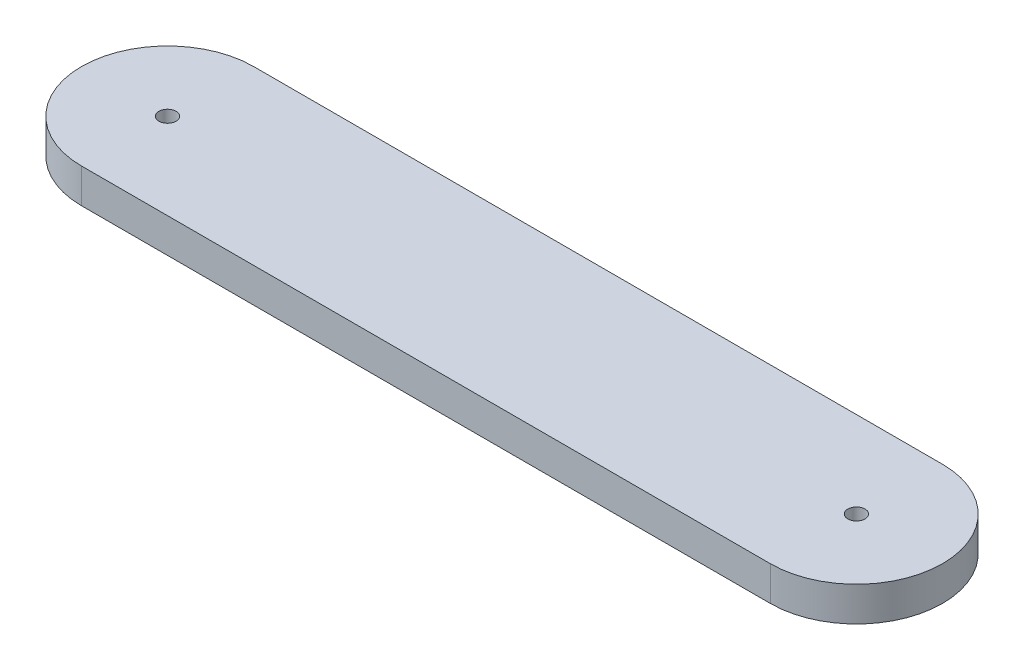
ISO-10303-21;
HEADER;
FILE_DESCRIPTION(('STEP AP214'),'2;1');
FILE_NAME('part.step','',(''),(''),'','','');
FILE_SCHEMA(('AUTOMOTIVE_DESIGN { 1 0 10303 214 1 1 1 1 }'));
ENDSEC;
DATA;
#1=APPLICATION_CONTEXT('core data for automotive mechanical design processes');
#2=APPLICATION_PROTOCOL_DEFINITION('international standard','automotive_design',2000,#1);
#3=PRODUCT_CONTEXT('',#1,'mechanical');
#4=PRODUCT('Part','Part','',(#3));
#5=PRODUCT_RELATED_PRODUCT_CATEGORY('part','',(#4));
#6=PRODUCT_DEFINITION_FORMATION('','',#4);
#7=PRODUCT_DEFINITION_CONTEXT('part definition',#1,'design');
#8=PRODUCT_DEFINITION('design','',#6,#7);
#9=PRODUCT_DEFINITION_SHAPE('','',#8);
#10=(LENGTH_UNIT() NAMED_UNIT(*) SI_UNIT(.MILLI.,.METRE.));
#11=(NAMED_UNIT(*) PLANE_ANGLE_UNIT() SI_UNIT($,.RADIAN.));
#12=(NAMED_UNIT(*) SI_UNIT($,.STERADIAN.) SOLID_ANGLE_UNIT());
#13=UNCERTAINTY_MEASURE_WITH_UNIT(LENGTH_MEASURE(1.E-05),#10,'distance_accuracy_value','');
#14=(GEOMETRIC_REPRESENTATION_CONTEXT(3) GLOBAL_UNCERTAINTY_ASSIGNED_CONTEXT((#13)) GLOBAL_UNIT_ASSIGNED_CONTEXT((#10,
#11,#12)) REPRESENTATION_CONTEXT('',''));
#15=CARTESIAN_POINT('',(0.,0.,0.));
#16=DIRECTION('',(0.,0.,1.));
#17=DIRECTION('',(1.,0.,0.));
#18=AXIS2_PLACEMENT_3D('',#15,#16,#17);
#19=CARTESIAN_POINT('',(0.,10.,0.));
#20=DIRECTION('',(0.,1.,0.));
#21=DIRECTION('',(0.,0.,1.));
#22=AXIS2_PLACEMENT_3D('',#19,#20,#21);
#23=PLANE('',#22);
#24=CARTESIAN_POINT('',(200.,10.,0.));
#25=DIRECTION('',(0.,1.,0.));
#26=DIRECTION('',(0.,0.,1.));
#27=AXIS2_PLACEMENT_3D('',#24,#25,#26);
#28=CIRCLE('',#27,2.5);
#29=CARTESIAN_POINT('',(200.,10.,2.5));
#30=VERTEX_POINT('',#29);
#31=EDGE_CURVE('E100',#30,#30,#28,.T.);
#32=ORIENTED_EDGE('',*,*,#31,.F.);
#33=EDGE_LOOP('',(#32));
#34=FACE_BOUND('',#33,.T.);
#35=CARTESIAN_POINT('',(0.,10.,0.));
#36=DIRECTION('',(0.,1.,0.));
#37=DIRECTION('',(0.,0.,1.));
#38=AXIS2_PLACEMENT_3D('',#35,#36,#37);
#39=CIRCLE('',#38,25.);
#40=CARTESIAN_POINT('',(0.,10.,-25.));
#41=VERTEX_POINT('',#40);
#42=CARTESIAN_POINT('',(0.,10.,25.));
#43=VERTEX_POINT('',#42);
#44=EDGE_CURVE('E85',#41,#43,#39,.T.);
#45=ORIENTED_EDGE('',*,*,#44,.T.);
#46=DIRECTION('',(1.,0.,0.));
#47=VECTOR('',#46,1.);
#48=CARTESIAN_POINT('',(0.,10.,25.));
#49=LINE('',#48,#47);
#50=CARTESIAN_POINT('',(200.,10.,25.));
#51=VERTEX_POINT('',#50);
#52=EDGE_CURVE('E80',#43,#51,#49,.T.);
#53=ORIENTED_EDGE('',*,*,#52,.T.);
#54=CARTESIAN_POINT('',(200.,10.,0.));
#55=DIRECTION('',(0.,1.,0.));
#56=DIRECTION('',(0.,0.,1.));
#57=AXIS2_PLACEMENT_3D('',#54,#55,#56);
#58=CIRCLE('',#57,25.);
#59=CARTESIAN_POINT('',(200.,10.,-25.));
#60=VERTEX_POINT('',#59);
#61=EDGE_CURVE('E83',#51,#60,#58,.T.);
#62=ORIENTED_EDGE('',*,*,#61,.T.);
#63=DIRECTION('',(-1.,0.,0.));
#64=VECTOR('',#63,1.);
#65=CARTESIAN_POINT('',(0.,10.,-25.));
#66=LINE('',#65,#64);
#67=EDGE_CURVE('E50',#60,#41,#66,.T.);
#68=ORIENTED_EDGE('',*,*,#67,.T.);
#69=EDGE_LOOP('',(#45,#53,#62,#68));
#70=FACE_BOUND('',#69,.T.);
#71=CARTESIAN_POINT('',(0.,10.,0.));
#72=DIRECTION('',(0.,1.,0.));
#73=DIRECTION('',(0.,0.,1.));
#74=AXIS2_PLACEMENT_3D('',#71,#72,#73);
#75=CIRCLE('',#74,2.5);
#76=CARTESIAN_POINT('',(0.,10.,2.5));
#77=VERTEX_POINT('',#76);
#78=EDGE_CURVE('E115',#77,#77,#75,.T.);
#79=ORIENTED_EDGE('',*,*,#78,.F.);
#80=EDGE_LOOP('',(#79));
#81=FACE_BOUND('',#80,.T.);
#82=ADVANCED_FACE('F33',(#34,#70,#81),#23,.T.);
#83=CARTESIAN_POINT('',(0.,0.,0.));
#84=DIRECTION('',(0.,1.,0.));
#85=DIRECTION('',(0.,0.,1.));
#86=AXIS2_PLACEMENT_3D('',#83,#84,#85);
#87=PLANE('',#86);
#88=CARTESIAN_POINT('',(0.,0.,0.));
#89=DIRECTION('',(0.,1.,0.));
#90=DIRECTION('',(0.,0.,1.));
#91=AXIS2_PLACEMENT_3D('',#88,#89,#90);
#92=CIRCLE('',#91,25.);
#93=CARTESIAN_POINT('',(0.,0.,-25.));
#94=VERTEX_POINT('',#93);
#95=CARTESIAN_POINT('',(0.,0.,25.));
#96=VERTEX_POINT('',#95);
#97=EDGE_CURVE('E97',#94,#96,#92,.T.);
#98=ORIENTED_EDGE('',*,*,#97,.F.);
#99=DIRECTION('',(-1.,0.,0.));
#100=VECTOR('',#99,1.);
#101=CARTESIAN_POINT('',(0.,0.,-25.));
#102=LINE('',#101,#100);
#103=CARTESIAN_POINT('',(200.,0.,-25.));
#104=VERTEX_POINT('',#103);
#105=EDGE_CURVE('E73',#104,#94,#102,.T.);
#106=ORIENTED_EDGE('',*,*,#105,.F.);
#107=CARTESIAN_POINT('',(200.,0.,0.));
#108=DIRECTION('',(0.,1.,0.));
#109=DIRECTION('',(0.,0.,1.));
#110=AXIS2_PLACEMENT_3D('',#107,#108,#109);
#111=CIRCLE('',#110,25.);
#112=CARTESIAN_POINT('',(200.,0.,25.));
#113=VERTEX_POINT('',#112);
#114=EDGE_CURVE('E67',#113,#104,#111,.T.);
#115=ORIENTED_EDGE('',*,*,#114,.F.);
#116=DIRECTION('',(1.,0.,0.));
#117=VECTOR('',#116,1.);
#118=CARTESIAN_POINT('',(0.,0.,25.));
#119=LINE('',#118,#117);
#120=EDGE_CURVE('E89',#96,#113,#119,.T.);
#121=ORIENTED_EDGE('',*,*,#120,.F.);
#122=EDGE_LOOP('',(#98,#106,#115,#121));
#123=FACE_BOUND('',#122,.T.);
#124=CARTESIAN_POINT('',(200.,0.,0.));
#125=DIRECTION('',(0.,1.,0.));
#126=DIRECTION('',(0.,0.,1.));
#127=AXIS2_PLACEMENT_3D('',#124,#125,#126);
#128=CIRCLE('',#127,2.5);
#129=CARTESIAN_POINT('',(200.,0.,2.5));
#130=VERTEX_POINT('',#129);
#131=EDGE_CURVE('E112',#130,#130,#128,.T.);
#132=ORIENTED_EDGE('',*,*,#131,.T.);
#133=EDGE_LOOP('',(#132));
#134=FACE_BOUND('',#133,.T.);
#135=CARTESIAN_POINT('',(0.,0.,0.));
#136=DIRECTION('',(0.,1.,0.));
#137=DIRECTION('',(0.,0.,1.));
#138=AXIS2_PLACEMENT_3D('',#135,#136,#137);
#139=CIRCLE('',#138,2.5);
#140=CARTESIAN_POINT('',(0.,0.,2.5));
#141=VERTEX_POINT('',#140);
#142=EDGE_CURVE('E118',#141,#141,#139,.T.);
#143=ORIENTED_EDGE('',*,*,#142,.T.);
#144=EDGE_LOOP('',(#143));
#145=FACE_BOUND('',#144,.T.);
#146=ADVANCED_FACE('F108',(#123,#134,#145),#87,.F.);
#147=CARTESIAN_POINT('',(0.,10.,0.));
#148=DIRECTION('',(0.,-1.,0.));
#149=DIRECTION('',(0.,0.,-1.));
#150=AXIS2_PLACEMENT_3D('',#147,#148,#149);
#151=CYLINDRICAL_SURFACE('',#150,25.);
#152=ORIENTED_EDGE('',*,*,#97,.T.);
#153=DIRECTION('',(0.,-1.,0.));
#154=VECTOR('',#153,1.);
#155=CARTESIAN_POINT('',(0.,10.,25.));
#156=LINE('',#155,#154);
#157=EDGE_CURVE('E11',#43,#96,#156,.T.);
#158=ORIENTED_EDGE('',*,*,#157,.F.);
#159=ORIENTED_EDGE('',*,*,#44,.F.);
#160=DIRECTION('',(0.,-1.,0.));
#161=VECTOR('',#160,1.);
#162=CARTESIAN_POINT('',(0.,10.,-25.));
#163=LINE('',#162,#161);
#164=EDGE_CURVE('E93',#41,#94,#163,.T.);
#165=ORIENTED_EDGE('',*,*,#164,.T.);
#166=EDGE_LOOP('',(#152,#158,#159,#165));
#167=FACE_BOUND('',#166,.T.);
#168=ADVANCED_FACE('F35',(#167),#151,.T.);
#169=CARTESIAN_POINT('',(0.,10.,25.));
#170=DIRECTION('',(0.,0.,-1.));
#171=DIRECTION('',(-1.,0.,0.));
#172=AXIS2_PLACEMENT_3D('',#169,#170,#171);
#173=PLANE('',#172);
#174=ORIENTED_EDGE('',*,*,#120,.T.);
#175=DIRECTION('',(0.,-1.,0.));
#176=VECTOR('',#175,1.);
#177=CARTESIAN_POINT('',(200.,10.,25.));
#178=LINE('',#177,#176);
#179=EDGE_CURVE('E42',#51,#113,#178,.T.);
#180=ORIENTED_EDGE('',*,*,#179,.F.);
#181=ORIENTED_EDGE('',*,*,#52,.F.);
#182=ORIENTED_EDGE('',*,*,#157,.T.);
#183=EDGE_LOOP('',(#174,#180,#181,#182));
#184=FACE_BOUND('',#183,.T.);
#185=ADVANCED_FACE('F88',(#184),#173,.F.);
#186=CARTESIAN_POINT('',(200.,10.,0.));
#187=DIRECTION('',(0.,-1.,0.));
#188=DIRECTION('',(0.,0.,-1.));
#189=AXIS2_PLACEMENT_3D('',#186,#187,#188);
#190=CYLINDRICAL_SURFACE('',#189,25.);
#191=ORIENTED_EDGE('',*,*,#114,.T.);
#192=DIRECTION('',(0.,-1.,0.));
#193=VECTOR('',#192,1.);
#194=CARTESIAN_POINT('',(200.,10.,-25.));
#195=LINE('',#194,#193);
#196=EDGE_CURVE('E90',#60,#104,#195,.T.);
#197=ORIENTED_EDGE('',*,*,#196,.F.);
#198=ORIENTED_EDGE('',*,*,#61,.F.);
#199=ORIENTED_EDGE('',*,*,#179,.T.);
#200=EDGE_LOOP('',(#191,#197,#198,#199));
#201=FACE_BOUND('',#200,.T.);
#202=ADVANCED_FACE('F91',(#201),#190,.T.);
#203=CARTESIAN_POINT('',(0.,10.,-25.));
#204=DIRECTION('',(0.,0.,1.));
#205=DIRECTION('',(1.,0.,0.));
#206=AXIS2_PLACEMENT_3D('',#203,#204,#205);
#207=PLANE('',#206);
#208=ORIENTED_EDGE('',*,*,#105,.T.);
#209=ORIENTED_EDGE('',*,*,#164,.F.);
#210=ORIENTED_EDGE('',*,*,#67,.F.);
#211=ORIENTED_EDGE('',*,*,#196,.T.);
#212=EDGE_LOOP('',(#208,#209,#210,#211));
#213=FACE_BOUND('',#212,.T.);
#214=ADVANCED_FACE('F105',(#213),#207,.F.);
#215=CARTESIAN_POINT('',(200.,10.,0.));
#216=DIRECTION('',(0.,-1.,0.));
#217=DIRECTION('',(0.,0.,-1.));
#218=AXIS2_PLACEMENT_3D('',#215,#216,#217);
#219=CYLINDRICAL_SURFACE('',#218,2.5);
#220=ORIENTED_EDGE('',*,*,#31,.T.);
#221=EDGE_LOOP('',(#220));
#222=FACE_BOUND('',#221,.T.);
#223=ORIENTED_EDGE('',*,*,#131,.F.);
#224=EDGE_LOOP('',(#223));
#225=FACE_BOUND('',#224,.T.);
#226=ADVANCED_FACE('F135',(#222,#225),#219,.F.);
#227=CARTESIAN_POINT('',(0.,10.,0.));
#228=DIRECTION('',(0.,-1.,0.));
#229=DIRECTION('',(0.,0.,-1.));
#230=AXIS2_PLACEMENT_3D('',#227,#228,#229);
#231=CYLINDRICAL_SURFACE('',#230,2.5);
#232=ORIENTED_EDGE('',*,*,#78,.T.);
#233=EDGE_LOOP('',(#232));
#234=FACE_BOUND('',#233,.T.);
#235=ORIENTED_EDGE('',*,*,#142,.F.);
#236=EDGE_LOOP('',(#235));
#237=FACE_BOUND('',#236,.T.);
#238=ADVANCED_FACE('F124',(#234,#237),#231,.F.);
#239=CLOSED_SHELL('',(#82,#146,#168,#185,#202,#214,#226,#238));
#240=MANIFOLD_SOLID_BREP('B2',#239);
#241=ADVANCED_BREP_SHAPE_REPRESENTATION('',(#18,#240),#14);
#242=SHAPE_DEFINITION_REPRESENTATION(#9,#241);
ENDSEC;
END-ISO-10303-21;
